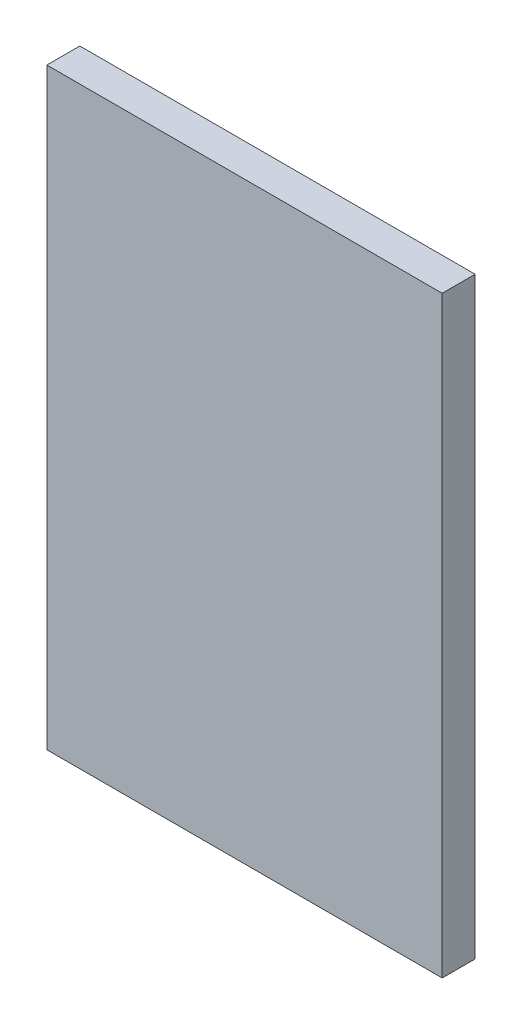
ISO-10303-21;
HEADER;
FILE_DESCRIPTION(('STEP AP214'),'2;1');
FILE_NAME('part.step','',(''),(''),'','','');
FILE_SCHEMA(('AUTOMOTIVE_DESIGN { 1 0 10303 214 1 1 1 1 }'));
ENDSEC;
DATA;
#1=APPLICATION_CONTEXT('core data for automotive mechanical design processes');
#2=APPLICATION_PROTOCOL_DEFINITION('international standard','automotive_design',2000,#1);
#3=PRODUCT_CONTEXT('',#1,'mechanical');
#4=PRODUCT('Part','Part','',(#3));
#5=PRODUCT_RELATED_PRODUCT_CATEGORY('part','',(#4));
#6=PRODUCT_DEFINITION_FORMATION('','',#4);
#7=PRODUCT_DEFINITION_CONTEXT('part definition',#1,'design');
#8=PRODUCT_DEFINITION('design','',#6,#7);
#9=PRODUCT_DEFINITION_SHAPE('','',#8);
#10=(LENGTH_UNIT() NAMED_UNIT(*) SI_UNIT(.MILLI.,.METRE.));
#11=(NAMED_UNIT(*) PLANE_ANGLE_UNIT() SI_UNIT($,.RADIAN.));
#12=(NAMED_UNIT(*) SI_UNIT($,.STERADIAN.) SOLID_ANGLE_UNIT());
#13=UNCERTAINTY_MEASURE_WITH_UNIT(LENGTH_MEASURE(1.E-05),#10,'distance_accuracy_value','');
#14=(GEOMETRIC_REPRESENTATION_CONTEXT(3) GLOBAL_UNCERTAINTY_ASSIGNED_CONTEXT((#13)) GLOBAL_UNIT_ASSIGNED_CONTEXT((#10,
#11,#12)) REPRESENTATION_CONTEXT('',''));
#15=CARTESIAN_POINT('',(0.,0.,0.));
#16=DIRECTION('',(0.,0.,1.));
#17=DIRECTION('',(1.,0.,0.));
#18=AXIS2_PLACEMENT_3D('',#15,#16,#17);
#19=CARTESIAN_POINT('',(6.,-9.,1.));
#20=DIRECTION('',(-1.,0.,0.));
#21=DIRECTION('',(0.,0.,1.));
#22=AXIS2_PLACEMENT_3D('',#19,#20,#21);
#23=PLANE('',#22);
#24=DIRECTION('',(0.,1.,0.));
#25=VECTOR('',#24,1.);
#26=CARTESIAN_POINT('',(6.,-9.,0.));
#27=LINE('',#26,#25);
#28=CARTESIAN_POINT('',(6.,-9.,0.));
#29=VERTEX_POINT('',#28);
#30=CARTESIAN_POINT('',(6.,9.,0.));
#31=VERTEX_POINT('',#30);
#32=EDGE_CURVE('E113',#29,#31,#27,.T.);
#33=ORIENTED_EDGE('',*,*,#32,.T.);
#34=DIRECTION('',(0.,0.,-1.));
#35=VECTOR('',#34,1.);
#36=CARTESIAN_POINT('',(6.,9.,1.));
#37=LINE('',#36,#35);
#38=CARTESIAN_POINT('',(6.,9.,1.));
#39=VERTEX_POINT('',#38);
#40=EDGE_CURVE('E11',#39,#31,#37,.T.);
#41=ORIENTED_EDGE('',*,*,#40,.F.);
#42=DIRECTION('',(0.,1.,0.));
#43=VECTOR('',#42,1.);
#44=CARTESIAN_POINT('',(6.,-9.,1.));
#45=LINE('',#44,#43);
#46=CARTESIAN_POINT('',(6.,-9.,1.));
#47=VERTEX_POINT('',#46);
#48=EDGE_CURVE('E95',#47,#39,#45,.T.);
#49=ORIENTED_EDGE('',*,*,#48,.F.);
#50=DIRECTION('',(0.,0.,-1.));
#51=VECTOR('',#50,1.);
#52=CARTESIAN_POINT('',(6.,-9.,1.));
#53=LINE('',#52,#51);
#54=EDGE_CURVE('E109',#47,#29,#53,.T.);
#55=ORIENTED_EDGE('',*,*,#54,.T.);
#56=EDGE_LOOP('',(#33,#41,#49,#55));
#57=FACE_BOUND('',#56,.T.);
#58=ADVANCED_FACE('F43',(#57),#23,.F.);
#59=CARTESIAN_POINT('',(-6.,9.,1.));
#60=DIRECTION('',(0.,-1.,0.));
#61=DIRECTION('',(0.,0.,-1.));
#62=AXIS2_PLACEMENT_3D('',#59,#60,#61);
#63=PLANE('',#62);
#64=DIRECTION('',(-1.,0.,0.));
#65=VECTOR('',#64,1.);
#66=CARTESIAN_POINT('',(-6.,9.,0.));
#67=LINE('',#66,#65);
#68=CARTESIAN_POINT('',(-6.,9.,0.));
#69=VERTEX_POINT('',#68);
#70=EDGE_CURVE('E100',#31,#69,#67,.T.);
#71=ORIENTED_EDGE('',*,*,#70,.T.);
#72=DIRECTION('',(0.,0.,-1.));
#73=VECTOR('',#72,1.);
#74=CARTESIAN_POINT('',(-6.,9.,1.));
#75=LINE('',#74,#73);
#76=CARTESIAN_POINT('',(-6.,9.,1.));
#77=VERTEX_POINT('',#76);
#78=EDGE_CURVE('E52',#77,#69,#75,.T.);
#79=ORIENTED_EDGE('',*,*,#78,.F.);
#80=DIRECTION('',(-1.,0.,0.));
#81=VECTOR('',#80,1.);
#82=CARTESIAN_POINT('',(-6.,9.,1.));
#83=LINE('',#82,#81);
#84=EDGE_CURVE('E90',#39,#77,#83,.T.);
#85=ORIENTED_EDGE('',*,*,#84,.F.);
#86=ORIENTED_EDGE('',*,*,#40,.T.);
#87=EDGE_LOOP('',(#71,#79,#85,#86));
#88=FACE_BOUND('',#87,.T.);
#89=ADVANCED_FACE('F99',(#88),#63,.F.);
#90=CARTESIAN_POINT('',(-6.,-9.,1.));
#91=DIRECTION('',(1.,0.,0.));
#92=DIRECTION('',(0.,0.,-1.));
#93=AXIS2_PLACEMENT_3D('',#90,#91,#92);
#94=PLANE('',#93);
#95=DIRECTION('',(0.,-1.,0.));
#96=VECTOR('',#95,1.);
#97=CARTESIAN_POINT('',(-6.,-9.,0.));
#98=LINE('',#97,#96);
#99=CARTESIAN_POINT('',(-6.,-9.,0.));
#100=VERTEX_POINT('',#99);
#101=EDGE_CURVE('E77',#69,#100,#98,.T.);
#102=ORIENTED_EDGE('',*,*,#101,.T.);
#103=DIRECTION('',(0.,0.,-1.));
#104=VECTOR('',#103,1.);
#105=CARTESIAN_POINT('',(-6.,-9.,1.));
#106=LINE('',#105,#104);
#107=CARTESIAN_POINT('',(-6.,-9.,1.));
#108=VERTEX_POINT('',#107);
#109=EDGE_CURVE('E102',#108,#100,#106,.T.);
#110=ORIENTED_EDGE('',*,*,#109,.F.);
#111=DIRECTION('',(0.,-1.,0.));
#112=VECTOR('',#111,1.);
#113=CARTESIAN_POINT('',(-6.,-9.,1.));
#114=LINE('',#113,#112);
#115=EDGE_CURVE('E93',#77,#108,#114,.T.);
#116=ORIENTED_EDGE('',*,*,#115,.F.);
#117=ORIENTED_EDGE('',*,*,#78,.T.);
#118=EDGE_LOOP('',(#102,#110,#116,#117));
#119=FACE_BOUND('',#118,.T.);
#120=ADVANCED_FACE('F103',(#119),#94,.F.);
#121=CARTESIAN_POINT('',(-6.,-9.,1.));
#122=DIRECTION('',(0.,1.,0.));
#123=DIRECTION('',(0.,0.,1.));
#124=AXIS2_PLACEMENT_3D('',#121,#122,#123);
#125=PLANE('',#124);
#126=DIRECTION('',(1.,0.,0.));
#127=VECTOR('',#126,1.);
#128=CARTESIAN_POINT('',(-6.,-9.,0.));
#129=LINE('',#128,#127);
#130=EDGE_CURVE('E83',#100,#29,#129,.T.);
#131=ORIENTED_EDGE('',*,*,#130,.T.);
#132=ORIENTED_EDGE('',*,*,#54,.F.);
#133=DIRECTION('',(1.,0.,0.));
#134=VECTOR('',#133,1.);
#135=CARTESIAN_POINT('',(-6.,-9.,1.));
#136=LINE('',#135,#134);
#137=EDGE_CURVE('E60',#108,#47,#136,.T.);
#138=ORIENTED_EDGE('',*,*,#137,.F.);
#139=ORIENTED_EDGE('',*,*,#109,.T.);
#140=EDGE_LOOP('',(#131,#132,#138,#139));
#141=FACE_BOUND('',#140,.T.);
#142=ADVANCED_FACE('F127',(#141),#125,.F.);
#143=CARTESIAN_POINT('',(0.,0.,1.));
#144=DIRECTION('',(0.,0.,-1.));
#145=DIRECTION('',(-1.,0.,0.));
#146=AXIS2_PLACEMENT_3D('',#143,#144,#145);
#147=PLANE('',#146);
#148=ORIENTED_EDGE('',*,*,#48,.T.);
#149=ORIENTED_EDGE('',*,*,#84,.T.);
#150=ORIENTED_EDGE('',*,*,#115,.T.);
#151=ORIENTED_EDGE('',*,*,#137,.T.);
#152=EDGE_LOOP('',(#148,#149,#150,#151));
#153=FACE_BOUND('',#152,.T.);
#154=ADVANCED_FACE('F91',(#153),#147,.F.);
#155=CARTESIAN_POINT('',(0.,0.,0.));
#156=DIRECTION('',(0.,0.,-1.));
#157=DIRECTION('',(-1.,0.,0.));
#158=AXIS2_PLACEMENT_3D('',#155,#156,#157);
#159=PLANE('',#158);
#160=ORIENTED_EDGE('',*,*,#32,.F.);
#161=ORIENTED_EDGE('',*,*,#130,.F.);
#162=ORIENTED_EDGE('',*,*,#101,.F.);
#163=ORIENTED_EDGE('',*,*,#70,.F.);
#164=EDGE_LOOP('',(#160,#161,#162,#163));
#165=FACE_BOUND('',#164,.T.);
#166=ADVANCED_FACE('F130',(#165),#159,.T.);
#167=CLOSED_SHELL('',(#58,#89,#120,#142,#154,#166));
#168=MANIFOLD_SOLID_BREP('B2',#167);
#169=ADVANCED_BREP_SHAPE_REPRESENTATION('',(#18,#168),#14);
#170=SHAPE_DEFINITION_REPRESENTATION(#9,#169);
ENDSEC;
END-ISO-10303-21;
